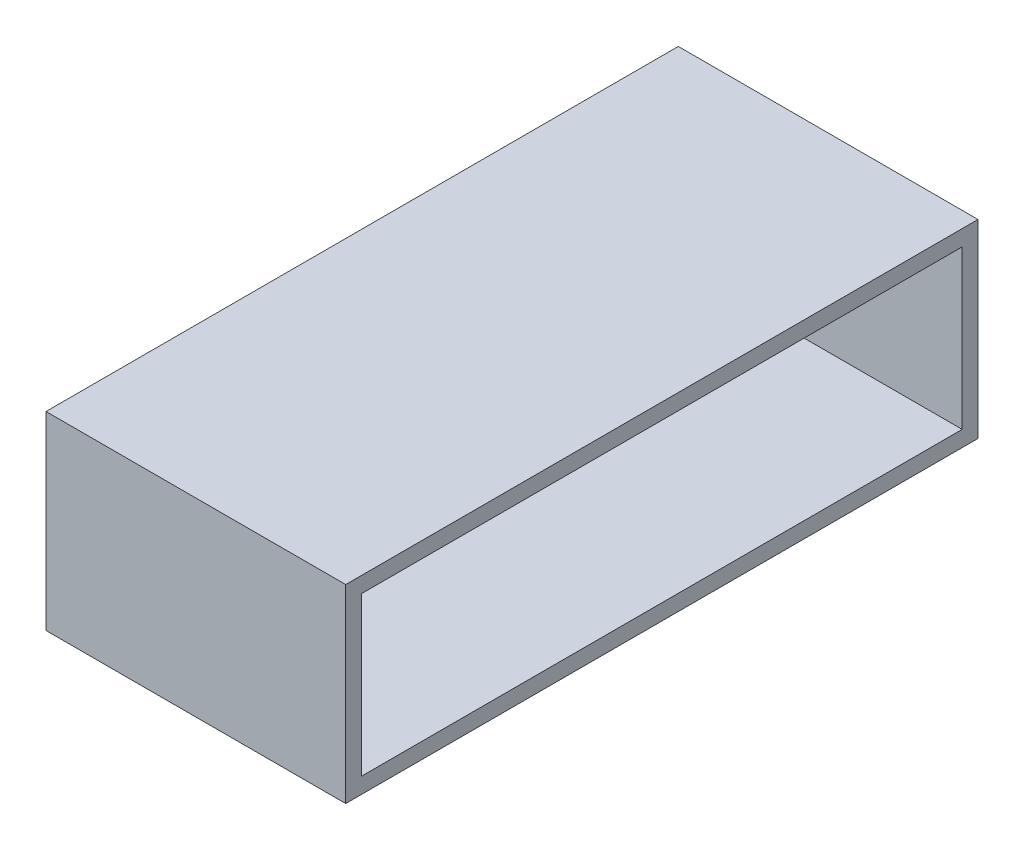
ISO-10303-21;
HEADER;
FILE_DESCRIPTION(('STEP AP214'),'2;1');
FILE_NAME('part.step','',(''),(''),'','','');
FILE_SCHEMA(('AUTOMOTIVE_DESIGN { 1 0 10303 214 1 1 1 1 }'));
ENDSEC;
DATA;
#1=APPLICATION_CONTEXT('core data for automotive mechanical design processes');
#2=APPLICATION_PROTOCOL_DEFINITION('international standard','automotive_design',2000,#1);
#3=PRODUCT_CONTEXT('',#1,'mechanical');
#4=PRODUCT('Part','Part','',(#3));
#5=PRODUCT_RELATED_PRODUCT_CATEGORY('part','',(#4));
#6=PRODUCT_DEFINITION_FORMATION('','',#4);
#7=PRODUCT_DEFINITION_CONTEXT('part definition',#1,'design');
#8=PRODUCT_DEFINITION('design','',#6,#7);
#9=PRODUCT_DEFINITION_SHAPE('','',#8);
#10=(LENGTH_UNIT() NAMED_UNIT(*) SI_UNIT(.MILLI.,.METRE.));
#11=(NAMED_UNIT(*) PLANE_ANGLE_UNIT() SI_UNIT($,.RADIAN.));
#12=(NAMED_UNIT(*) SI_UNIT($,.STERADIAN.) SOLID_ANGLE_UNIT());
#13=UNCERTAINTY_MEASURE_WITH_UNIT(LENGTH_MEASURE(1.E-05),#10,'distance_accuracy_value','');
#14=(GEOMETRIC_REPRESENTATION_CONTEXT(3) GLOBAL_UNCERTAINTY_ASSIGNED_CONTEXT((#13)) GLOBAL_UNIT_ASSIGNED_CONTEXT((#10,
#11,#12)) REPRESENTATION_CONTEXT('',''));
#15=CARTESIAN_POINT('',(0.,0.,0.));
#16=DIRECTION('',(0.,0.,1.));
#17=DIRECTION('',(1.,0.,0.));
#18=AXIS2_PLACEMENT_3D('',#15,#16,#17);
#19=CARTESIAN_POINT('',(-474.,-300.,2000.));
#20=DIRECTION('',(1.,0.,0.));
#21=DIRECTION('',(0.,0.,-1.));
#22=AXIS2_PLACEMENT_3D('',#19,#20,#21);
#23=PLANE('',#22);
#24=DIRECTION('',(0.,-1.,0.));
#25=VECTOR('',#24,1.);
#26=CARTESIAN_POINT('',(-474.,-300.,0.));
#27=LINE('',#26,#25);
#28=CARTESIAN_POINT('',(-474.,300.,0.));
#29=VERTEX_POINT('',#28);
#30=CARTESIAN_POINT('',(-474.,-300.,0.));
#31=VERTEX_POINT('',#30);
#32=EDGE_CURVE('E127',#29,#31,#27,.T.);
#33=ORIENTED_EDGE('',*,*,#32,.T.);
#34=DIRECTION('',(0.,0.,-1.));
#35=VECTOR('',#34,1.);
#36=CARTESIAN_POINT('',(-474.,-300.,2000.));
#37=LINE('',#36,#35);
#38=CARTESIAN_POINT('',(-474.,-300.,2000.));
#39=VERTEX_POINT('',#38);
#40=EDGE_CURVE('E11',#39,#31,#37,.T.);
#41=ORIENTED_EDGE('',*,*,#40,.F.);
#42=DIRECTION('',(0.,-1.,0.));
#43=VECTOR('',#42,1.);
#44=CARTESIAN_POINT('',(-474.,-300.,2000.));
#45=LINE('',#44,#43);
#46=CARTESIAN_POINT('',(-474.,300.,2000.));
#47=VERTEX_POINT('',#46);
#48=EDGE_CURVE('E131',#47,#39,#45,.T.);
#49=ORIENTED_EDGE('',*,*,#48,.F.);
#50=DIRECTION('',(0.,0.,-1.));
#51=VECTOR('',#50,1.);
#52=CARTESIAN_POINT('',(-474.,300.,2000.));
#53=LINE('',#52,#51);
#54=EDGE_CURVE('E141',#47,#29,#53,.T.);
#55=ORIENTED_EDGE('',*,*,#54,.T.);
#56=EDGE_LOOP('',(#33,#41,#49,#55));
#57=FACE_BOUND('',#56,.T.);
#58=DIRECTION('',(0.,1.,0.));
#59=VECTOR('',#58,1.);
#60=CARTESIAN_POINT('',(-474.,0.,1950.));
#61=LINE('',#60,#59);
#62=CARTESIAN_POINT('',(-474.,-250.,1950.));
#63=VERTEX_POINT('',#62);
#64=CARTESIAN_POINT('',(-474.,250.,1950.));
#65=VERTEX_POINT('',#64);
#66=EDGE_CURVE('E104',#63,#65,#61,.T.);
#67=ORIENTED_EDGE('',*,*,#66,.F.);
#68=DIRECTION('',(0.,0.,1.));
#69=VECTOR('',#68,1.);
#70=CARTESIAN_POINT('',(-474.,-250.,0.));
#71=LINE('',#70,#69);
#72=CARTESIAN_POINT('',(-474.,-250.,50.));
#73=VERTEX_POINT('',#72);
#74=EDGE_CURVE('E96',#73,#63,#71,.T.);
#75=ORIENTED_EDGE('',*,*,#74,.F.);
#76=DIRECTION('',(0.,1.,0.));
#77=VECTOR('',#76,1.);
#78=CARTESIAN_POINT('',(-474.,0.,50.0000000000001));
#79=LINE('',#78,#77);
#80=CARTESIAN_POINT('',(-474.,250.,50.0000000000001));
#81=VERTEX_POINT('',#80);
#82=EDGE_CURVE('E46',#73,#81,#79,.T.);
#83=ORIENTED_EDGE('',*,*,#82,.T.);
#84=DIRECTION('',(0.,0.,1.));
#85=VECTOR('',#84,1.);
#86=CARTESIAN_POINT('',(-474.,250.,0.));
#87=LINE('',#86,#85);
#88=EDGE_CURVE('E108',#81,#65,#87,.T.);
#89=ORIENTED_EDGE('',*,*,#88,.T.);
#90=EDGE_LOOP('',(#67,#75,#83,#89));
#91=FACE_BOUND('',#90,.T.);
#92=ADVANCED_FACE('F32',(#57,#91),#23,.F.);
#93=CARTESIAN_POINT('',(474.,-300.,2000.));
#94=DIRECTION('',(-1.,0.,0.));
#95=DIRECTION('',(0.,0.,1.));
#96=AXIS2_PLACEMENT_3D('',#93,#94,#95);
#97=PLANE('',#96);
#98=DIRECTION('',(0.,1.,0.));
#99=VECTOR('',#98,1.);
#100=CARTESIAN_POINT('',(474.,-300.,0.));
#101=LINE('',#100,#99);
#102=CARTESIAN_POINT('',(474.,-300.,0.));
#103=VERTEX_POINT('',#102);
#104=CARTESIAN_POINT('',(474.,300.,0.));
#105=VERTEX_POINT('',#104);
#106=EDGE_CURVE('E146',#103,#105,#101,.T.);
#107=ORIENTED_EDGE('',*,*,#106,.T.);
#108=DIRECTION('',(0.,0.,-1.));
#109=VECTOR('',#108,1.);
#110=CARTESIAN_POINT('',(474.,300.,2000.));
#111=LINE('',#110,#109);
#112=CARTESIAN_POINT('',(474.,300.,2000.));
#113=VERTEX_POINT('',#112);
#114=EDGE_CURVE('E151',#113,#105,#111,.T.);
#115=ORIENTED_EDGE('',*,*,#114,.F.);
#116=DIRECTION('',(0.,1.,0.));
#117=VECTOR('',#116,1.);
#118=CARTESIAN_POINT('',(474.,-300.,2000.));
#119=LINE('',#118,#117);
#120=CARTESIAN_POINT('',(474.,-300.,2000.));
#121=VERTEX_POINT('',#120);
#122=EDGE_CURVE('E137',#121,#113,#119,.T.);
#123=ORIENTED_EDGE('',*,*,#122,.F.);
#124=DIRECTION('',(0.,0.,-1.));
#125=VECTOR('',#124,1.);
#126=CARTESIAN_POINT('',(474.,-300.,2000.));
#127=LINE('',#126,#125);
#128=EDGE_CURVE('E39',#121,#103,#127,.T.);
#129=ORIENTED_EDGE('',*,*,#128,.T.);
#130=EDGE_LOOP('',(#107,#115,#123,#129));
#131=FACE_BOUND('',#130,.T.);
#132=DIRECTION('',(0.,1.,0.));
#133=VECTOR('',#132,1.);
#134=CARTESIAN_POINT('',(474.,0.,1950.));
#135=LINE('',#134,#133);
#136=CARTESIAN_POINT('',(474.,-250.,1950.));
#137=VERTEX_POINT('',#136);
#138=CARTESIAN_POINT('',(474.,250.,1950.));
#139=VERTEX_POINT('',#138);
#140=EDGE_CURVE('E54',#137,#139,#135,.T.);
#141=ORIENTED_EDGE('',*,*,#140,.T.);
#142=DIRECTION('',(0.,0.,1.));
#143=VECTOR('',#142,1.);
#144=CARTESIAN_POINT('',(474.,250.,0.));
#145=LINE('',#144,#143);
#146=CARTESIAN_POINT('',(474.,250.,50.0000000000001));
#147=VERTEX_POINT('',#146);
#148=EDGE_CURVE('E112',#147,#139,#145,.T.);
#149=ORIENTED_EDGE('',*,*,#148,.F.);
#150=DIRECTION('',(0.,1.,0.));
#151=VECTOR('',#150,1.);
#152=CARTESIAN_POINT('',(474.,0.,50.0000000000001));
#153=LINE('',#152,#151);
#154=CARTESIAN_POINT('',(474.,-250.,50.0000000000001));
#155=VERTEX_POINT('',#154);
#156=EDGE_CURVE('E115',#155,#147,#153,.T.);
#157=ORIENTED_EDGE('',*,*,#156,.F.);
#158=DIRECTION('',(0.,0.,1.));
#159=VECTOR('',#158,1.);
#160=CARTESIAN_POINT('',(474.,-250.,0.));
#161=LINE('',#160,#159);
#162=EDGE_CURVE('E121',#155,#137,#161,.T.);
#163=ORIENTED_EDGE('',*,*,#162,.T.);
#164=EDGE_LOOP('',(#141,#149,#157,#163));
#165=FACE_BOUND('',#164,.T.);
#166=ADVANCED_FACE('F158',(#131,#165),#97,.F.);
#167=CARTESIAN_POINT('',(474.,-300.,2000.));
#168=DIRECTION('',(0.,1.,0.));
#169=DIRECTION('',(-1.,0.,0.));
#170=AXIS2_PLACEMENT_3D('',#167,#168,#169);
#171=PLANE('',#170);
#172=DIRECTION('',(1.,0.,0.));
#173=VECTOR('',#172,1.);
#174=CARTESIAN_POINT('',(474.,-300.,0.));
#175=LINE('',#174,#173);
#176=EDGE_CURVE('E144',#31,#103,#175,.T.);
#177=ORIENTED_EDGE('',*,*,#176,.T.);
#178=ORIENTED_EDGE('',*,*,#128,.F.);
#179=DIRECTION('',(1.,0.,0.));
#180=VECTOR('',#179,1.);
#181=CARTESIAN_POINT('',(474.,-300.,2000.));
#182=LINE('',#181,#180);
#183=EDGE_CURVE('E134',#39,#121,#182,.T.);
#184=ORIENTED_EDGE('',*,*,#183,.F.);
#185=ORIENTED_EDGE('',*,*,#40,.T.);
#186=EDGE_LOOP('',(#177,#178,#184,#185));
#187=FACE_BOUND('',#186,.T.);
#188=ADVANCED_FACE('F175',(#187),#171,.F.);
#189=CARTESIAN_POINT('',(474.,300.,2000.));
#190=DIRECTION('',(0.,-1.,0.));
#191=DIRECTION('',(1.,0.,0.));
#192=AXIS2_PLACEMENT_3D('',#189,#190,#191);
#193=PLANE('',#192);
#194=DIRECTION('',(-1.,0.,0.));
#195=VECTOR('',#194,1.);
#196=CARTESIAN_POINT('',(474.,300.,0.));
#197=LINE('',#196,#195);
#198=EDGE_CURVE('E135',#105,#29,#197,.T.);
#199=ORIENTED_EDGE('',*,*,#198,.T.);
#200=ORIENTED_EDGE('',*,*,#54,.F.);
#201=DIRECTION('',(-1.,0.,0.));
#202=VECTOR('',#201,1.);
#203=CARTESIAN_POINT('',(474.,300.,2000.));
#204=LINE('',#203,#202);
#205=EDGE_CURVE('E139',#113,#47,#204,.T.);
#206=ORIENTED_EDGE('',*,*,#205,.F.);
#207=ORIENTED_EDGE('',*,*,#114,.T.);
#208=EDGE_LOOP('',(#199,#200,#206,#207));
#209=FACE_BOUND('',#208,.T.);
#210=ADVANCED_FACE('F168',(#209),#193,.F.);
#211=CARTESIAN_POINT('',(0.,0.,2000.));
#212=DIRECTION('',(0.,0.,1.));
#213=DIRECTION('',(1.,0.,0.));
#214=AXIS2_PLACEMENT_3D('',#211,#212,#213);
#215=PLANE('',#214);
#216=ORIENTED_EDGE('',*,*,#48,.T.);
#217=ORIENTED_EDGE('',*,*,#183,.T.);
#218=ORIENTED_EDGE('',*,*,#122,.T.);
#219=ORIENTED_EDGE('',*,*,#205,.T.);
#220=EDGE_LOOP('',(#216,#217,#218,#219));
#221=FACE_BOUND('',#220,.T.);
#222=ADVANCED_FACE('F174',(#221),#215,.T.);
#223=CARTESIAN_POINT('',(0.,0.,0.));
#224=DIRECTION('',(0.,0.,1.));
#225=DIRECTION('',(1.,0.,0.));
#226=AXIS2_PLACEMENT_3D('',#223,#224,#225);
#227=PLANE('',#226);
#228=ORIENTED_EDGE('',*,*,#32,.F.);
#229=ORIENTED_EDGE('',*,*,#198,.F.);
#230=ORIENTED_EDGE('',*,*,#106,.F.);
#231=ORIENTED_EDGE('',*,*,#176,.F.);
#232=EDGE_LOOP('',(#228,#229,#230,#231));
#233=FACE_BOUND('',#232,.T.);
#234=ADVANCED_FACE('F165',(#233),#227,.F.);
#235=CARTESIAN_POINT('',(-474.,0.,1950.));
#236=DIRECTION('',(0.,0.,-1.));
#237=DIRECTION('',(-1.,0.,0.));
#238=AXIS2_PLACEMENT_3D('',#235,#236,#237);
#239=PLANE('',#238);
#240=ORIENTED_EDGE('',*,*,#140,.F.);
#241=DIRECTION('',(1.,0.,0.));
#242=VECTOR('',#241,1.);
#243=CARTESIAN_POINT('',(-474.,-250.,1950.));
#244=LINE('',#243,#242);
#245=EDGE_CURVE('E99',#63,#137,#244,.T.);
#246=ORIENTED_EDGE('',*,*,#245,.F.);
#247=ORIENTED_EDGE('',*,*,#66,.T.);
#248=DIRECTION('',(1.,0.,0.));
#249=VECTOR('',#248,1.);
#250=CARTESIAN_POINT('',(-474.,250.,1950.));
#251=LINE('',#250,#249);
#252=EDGE_CURVE('E125',#65,#139,#251,.T.);
#253=ORIENTED_EDGE('',*,*,#252,.T.);
#254=EDGE_LOOP('',(#240,#246,#247,#253));
#255=FACE_BOUND('',#254,.T.);
#256=ADVANCED_FACE('F106',(#255),#239,.T.);
#257=CARTESIAN_POINT('',(-474.,250.,0.));
#258=DIRECTION('',(0.,1.,0.));
#259=DIRECTION('',(0.,0.,1.));
#260=AXIS2_PLACEMENT_3D('',#257,#258,#259);
#261=PLANE('',#260);
#262=ORIENTED_EDGE('',*,*,#148,.T.);
#263=ORIENTED_EDGE('',*,*,#252,.F.);
#264=ORIENTED_EDGE('',*,*,#88,.F.);
#265=DIRECTION('',(1.,0.,0.));
#266=VECTOR('',#265,1.);
#267=CARTESIAN_POINT('',(-474.,250.,50.0000000000001));
#268=LINE('',#267,#266);
#269=EDGE_CURVE('E128',#81,#147,#268,.T.);
#270=ORIENTED_EDGE('',*,*,#269,.T.);
#271=EDGE_LOOP('',(#262,#263,#264,#270));
#272=FACE_BOUND('',#271,.T.);
#273=ADVANCED_FACE('F201',(#272),#261,.F.);
#274=CARTESIAN_POINT('',(-474.,0.,50.0000000000001));
#275=DIRECTION('',(0.,0.,-1.));
#276=DIRECTION('',(-1.,0.,0.));
#277=AXIS2_PLACEMENT_3D('',#274,#275,#276);
#278=PLANE('',#277);
#279=ORIENTED_EDGE('',*,*,#156,.T.);
#280=ORIENTED_EDGE('',*,*,#269,.F.);
#281=ORIENTED_EDGE('',*,*,#82,.F.);
#282=DIRECTION('',(1.,0.,0.));
#283=VECTOR('',#282,1.);
#284=CARTESIAN_POINT('',(-474.,-250.,50.0000000000001));
#285=LINE('',#284,#283);
#286=EDGE_CURVE('E101',#73,#155,#285,.T.);
#287=ORIENTED_EDGE('',*,*,#286,.T.);
#288=EDGE_LOOP('',(#279,#280,#281,#287));
#289=FACE_BOUND('',#288,.T.);
#290=ADVANCED_FACE('F211',(#289),#278,.F.);
#291=CARTESIAN_POINT('',(-474.,-250.,0.));
#292=DIRECTION('',(0.,1.,0.));
#293=DIRECTION('',(0.,0.,1.));
#294=AXIS2_PLACEMENT_3D('',#291,#292,#293);
#295=PLANE('',#294);
#296=ORIENTED_EDGE('',*,*,#162,.F.);
#297=ORIENTED_EDGE('',*,*,#286,.F.);
#298=ORIENTED_EDGE('',*,*,#74,.T.);
#299=ORIENTED_EDGE('',*,*,#245,.T.);
#300=EDGE_LOOP('',(#296,#297,#298,#299));
#301=FACE_BOUND('',#300,.T.);
#302=ADVANCED_FACE('F98',(#301),#295,.T.);
#303=CLOSED_SHELL('',(#92,#166,#188,#210,#222,#234,#256,#273,#290,#302));
#304=MANIFOLD_SOLID_BREP('B2',#303);
#305=ADVANCED_BREP_SHAPE_REPRESENTATION('',(#18,#304),#14);
#306=SHAPE_DEFINITION_REPRESENTATION(#9,#305);
ENDSEC;
END-ISO-10303-21;
